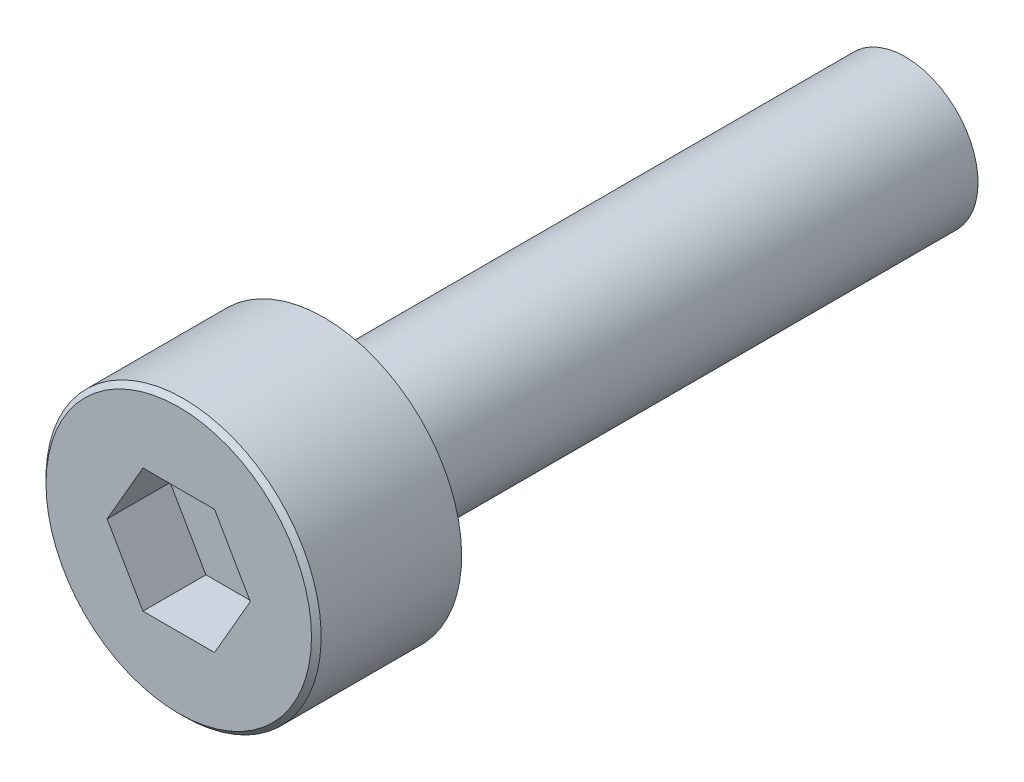
ISO-10303-21;
HEADER;
FILE_DESCRIPTION(('STEP AP214'),'2;1');
FILE_NAME('part.step','',(''),(''),'','','');
FILE_SCHEMA(('AUTOMOTIVE_DESIGN { 1 0 10303 214 1 1 1 1 }'));
ENDSEC;
DATA;
#1=APPLICATION_CONTEXT('core data for automotive mechanical design processes');
#2=APPLICATION_PROTOCOL_DEFINITION('international standard','automotive_design',2000,#1);
#3=PRODUCT_CONTEXT('',#1,'mechanical');
#4=PRODUCT('Part','Part','',(#3));
#5=PRODUCT_RELATED_PRODUCT_CATEGORY('part','',(#4));
#6=PRODUCT_DEFINITION_FORMATION('','',#4);
#7=PRODUCT_DEFINITION_CONTEXT('part definition',#1,'design');
#8=PRODUCT_DEFINITION('design','',#6,#7);
#9=PRODUCT_DEFINITION_SHAPE('','',#8);
#10=(LENGTH_UNIT() NAMED_UNIT(*) SI_UNIT(.MILLI.,.METRE.));
#11=(NAMED_UNIT(*) PLANE_ANGLE_UNIT() SI_UNIT($,.RADIAN.));
#12=(NAMED_UNIT(*) SI_UNIT($,.STERADIAN.) SOLID_ANGLE_UNIT());
#13=UNCERTAINTY_MEASURE_WITH_UNIT(LENGTH_MEASURE(1.E-05),#10,'distance_accuracy_value','');
#14=(GEOMETRIC_REPRESENTATION_CONTEXT(3) GLOBAL_UNCERTAINTY_ASSIGNED_CONTEXT((#13)) GLOBAL_UNIT_ASSIGNED_CONTEXT((#10,
#11,#12)) REPRESENTATION_CONTEXT('',''));
#15=CARTESIAN_POINT('',(0.,0.,0.));
#16=DIRECTION('',(0.,0.,1.));
#17=DIRECTION('',(1.,0.,0.));
#18=AXIS2_PLACEMENT_3D('',#15,#16,#17);
#19=CARTESIAN_POINT('',(0.,0.,0.));
#20=DIRECTION('',(0.,0.,1.));
#21=DIRECTION('',(0.,-1.,0.));
#22=AXIS2_PLACEMENT_3D('',#19,#20,#21);
#23=PLANE('',#22);
#24=CARTESIAN_POINT('',(0.,0.,0.));
#25=DIRECTION('',(0.,0.,1.));
#26=DIRECTION('',(0.,-1.,0.));
#27=AXIS2_PLACEMENT_3D('',#24,#25,#26);
#28=CIRCLE('',#27,2.73999999999999);
#29=CARTESIAN_POINT('',(0.,-2.73999999999999,0.));
#30=VERTEX_POINT('',#29);
#31=EDGE_CURVE('E11',#30,#30,#28,.T.);
#32=ORIENTED_EDGE('',*,*,#31,.T.);
#33=EDGE_LOOP('',(#32));
#34=FACE_BOUND('',#33,.T.);
#35=DIRECTION('',(-0.5,0.866025403784439,0.));
#36=VECTOR('',#35,1.);
#37=CARTESIAN_POINT('',(1.47801668912544,0.,0.));
#38=LINE('',#37,#36);
#39=CARTESIAN_POINT('',(1.47801668912544,0.,0.));
#40=VERTEX_POINT('',#39);
#41=CARTESIAN_POINT('',(0.739008344562721,1.28,0.));
#42=VERTEX_POINT('',#41);
#43=EDGE_CURVE('E57',#40,#42,#38,.T.);
#44=ORIENTED_EDGE('',*,*,#43,.F.);
#45=DIRECTION('',(0.5,0.866025403784439,0.));
#46=VECTOR('',#45,1.);
#47=CARTESIAN_POINT('',(0.739008344562721,-1.28,0.));
#48=LINE('',#47,#46);
#49=CARTESIAN_POINT('',(0.739008344562721,-1.28,0.));
#50=VERTEX_POINT('',#49);
#51=EDGE_CURVE('E140',#50,#40,#48,.T.);
#52=ORIENTED_EDGE('',*,*,#51,.F.);
#53=DIRECTION('',(1.,0.,0.));
#54=VECTOR('',#53,1.);
#55=CARTESIAN_POINT('',(-0.739008344562721,-1.28,0.));
#56=LINE('',#55,#54);
#57=CARTESIAN_POINT('',(-0.739008344562721,-1.28,0.));
#58=VERTEX_POINT('',#57);
#59=EDGE_CURVE('E138',#58,#50,#56,.T.);
#60=ORIENTED_EDGE('',*,*,#59,.F.);
#61=DIRECTION('',(0.5,-0.866025403784439,0.));
#62=VECTOR('',#61,1.);
#63=CARTESIAN_POINT('',(-1.47801668912544,0.,0.));
#64=LINE('',#63,#62);
#65=CARTESIAN_POINT('',(-1.47801668912544,0.,0.));
#66=VERTEX_POINT('',#65);
#67=EDGE_CURVE('E105',#66,#58,#64,.T.);
#68=ORIENTED_EDGE('',*,*,#67,.F.);
#69=DIRECTION('',(-0.5,-0.866025403784439,0.));
#70=VECTOR('',#69,1.);
#71=CARTESIAN_POINT('',(-0.739008344562721,1.28,0.));
#72=LINE('',#71,#70);
#73=CARTESIAN_POINT('',(-0.739008344562721,1.28,0.));
#74=VERTEX_POINT('',#73);
#75=EDGE_CURVE('E134',#74,#66,#72,.T.);
#76=ORIENTED_EDGE('',*,*,#75,.F.);
#77=DIRECTION('',(-1.,0.,0.));
#78=VECTOR('',#77,1.);
#79=CARTESIAN_POINT('',(0.739008344562721,1.28,0.));
#80=LINE('',#79,#78);
#81=EDGE_CURVE('E131',#42,#74,#80,.T.);
#82=ORIENTED_EDGE('',*,*,#81,.F.);
#83=EDGE_LOOP('',(#44,#52,#60,#68,#76,#82));
#84=FACE_BOUND('',#83,.T.);
#85=ADVANCED_FACE('F41',(#34,#84),#23,.T.);
#86=CARTESIAN_POINT('',(0.,0.,-15.));
#87=DIRECTION('',(0.,0.,-1.));
#88=DIRECTION('',(0.,1.,0.));
#89=AXIS2_PLACEMENT_3D('',#86,#87,#88);
#90=CYLINDRICAL_SURFACE('',#89,2.83999999999999);
#91=CARTESIAN_POINT('',(0.,0.,-0.100000000000001));
#92=DIRECTION('',(0.,0.,1.));
#93=DIRECTION('',(0.,-1.,0.));
#94=AXIS2_PLACEMENT_3D('',#91,#92,#93);
#95=CIRCLE('',#94,2.83999999999999);
#96=CARTESIAN_POINT('',(0.,-2.83999999999999,-0.100000000000001));
#97=VERTEX_POINT('',#96);
#98=EDGE_CURVE('E50',#97,#97,#95,.F.);
#99=ORIENTED_EDGE('',*,*,#98,.T.);
#100=EDGE_LOOP('',(#99));
#101=FACE_BOUND('',#100,.T.);
#102=CARTESIAN_POINT('',(0.,0.,-3.));
#103=DIRECTION('',(0.,0.,-1.));
#104=DIRECTION('',(0.,1.,0.));
#105=AXIS2_PLACEMENT_3D('',#102,#103,#104);
#106=CIRCLE('',#105,2.83999999999999);
#107=CARTESIAN_POINT('',(0.,2.83999999999999,-3.));
#108=VERTEX_POINT('',#107);
#109=EDGE_CURVE('E155',#108,#108,#106,.T.);
#110=ORIENTED_EDGE('',*,*,#109,.F.);
#111=EDGE_LOOP('',(#110));
#112=FACE_BOUND('',#111,.T.);
#113=ADVANCED_FACE('F160',(#101,#112),#90,.T.);
#114=CARTESIAN_POINT('',(0.,2.83999999999999,-3.));
#115=DIRECTION('',(0.,0.,-1.));
#116=DIRECTION('',(0.,1.,0.));
#117=AXIS2_PLACEMENT_3D('',#114,#115,#116);
#118=PLANE('',#117);
#119=ORIENTED_EDGE('',*,*,#109,.T.);
#120=EDGE_LOOP('',(#119));
#121=FACE_BOUND('',#120,.T.);
#122=CARTESIAN_POINT('',(0.,0.,-3.));
#123=DIRECTION('',(0.,0.,-1.));
#124=DIRECTION('',(0.,1.,0.));
#125=AXIS2_PLACEMENT_3D('',#122,#123,#124);
#126=CIRCLE('',#125,1.5);
#127=CARTESIAN_POINT('',(0.,1.5,-3.));
#128=VERTEX_POINT('',#127);
#129=EDGE_CURVE('E152',#128,#128,#126,.T.);
#130=ORIENTED_EDGE('',*,*,#129,.F.);
#131=EDGE_LOOP('',(#130));
#132=FACE_BOUND('',#131,.T.);
#133=ADVANCED_FACE('F176',(#121,#132),#118,.T.);
#134=CARTESIAN_POINT('',(0.,0.,-15.));
#135=DIRECTION('',(0.,0.,-1.));
#136=DIRECTION('',(0.,1.,0.));
#137=AXIS2_PLACEMENT_3D('',#134,#135,#136);
#138=CYLINDRICAL_SURFACE('',#137,1.5);
#139=ORIENTED_EDGE('',*,*,#129,.T.);
#140=EDGE_LOOP('',(#139));
#141=FACE_BOUND('',#140,.T.);
#142=CARTESIAN_POINT('',(0.,0.,-15.));
#143=DIRECTION('',(0.,0.,-1.));
#144=DIRECTION('',(0.,1.,0.));
#145=AXIS2_PLACEMENT_3D('',#142,#143,#144);
#146=CIRCLE('',#145,1.5);
#147=CARTESIAN_POINT('',(0.,1.5,-15.));
#148=VERTEX_POINT('',#147);
#149=EDGE_CURVE('E144',#148,#148,#146,.T.);
#150=ORIENTED_EDGE('',*,*,#149,.F.);
#151=EDGE_LOOP('',(#150));
#152=FACE_BOUND('',#151,.T.);
#153=ADVANCED_FACE('F182',(#141,#152),#138,.T.);
#154=CARTESIAN_POINT('',(0.,1.5,-15.));
#155=DIRECTION('',(0.,0.,-1.));
#156=DIRECTION('',(0.,1.,0.));
#157=AXIS2_PLACEMENT_3D('',#154,#155,#156);
#158=PLANE('',#157);
#159=ORIENTED_EDGE('',*,*,#149,.T.);
#160=EDGE_LOOP('',(#159));
#161=FACE_BOUND('',#160,.T.);
#162=ADVANCED_FACE('F186',(#161),#158,.T.);
#163=CARTESIAN_POINT('',(1.47801668912544,0.,-1.3));
#164=DIRECTION('',(0.866025403784439,0.5,0.));
#165=DIRECTION('',(-0.5,0.866025403784439,0.));
#166=AXIS2_PLACEMENT_3D('',#163,#164,#165);
#167=PLANE('',#166);
#168=ORIENTED_EDGE('',*,*,#43,.T.);
#169=DIRECTION('',(0.,0.,1.));
#170=VECTOR('',#169,1.);
#171=CARTESIAN_POINT('',(0.739008344562721,1.28,-1.3));
#172=LINE('',#171,#170);
#173=CARTESIAN_POINT('',(0.739008344562721,1.28,-1.3));
#174=VERTEX_POINT('',#173);
#175=EDGE_CURVE('E87',#174,#42,#172,.T.);
#176=ORIENTED_EDGE('',*,*,#175,.F.);
#177=DIRECTION('',(-0.5,0.866025403784439,0.));
#178=VECTOR('',#177,1.);
#179=CARTESIAN_POINT('',(1.47801668912544,0.,-1.3));
#180=LINE('',#179,#178);
#181=CARTESIAN_POINT('',(1.47801668912544,0.,-1.3));
#182=VERTEX_POINT('',#181);
#183=EDGE_CURVE('E142',#182,#174,#180,.T.);
#184=ORIENTED_EDGE('',*,*,#183,.F.);
#185=DIRECTION('',(0.,0.,1.));
#186=VECTOR('',#185,1.);
#187=CARTESIAN_POINT('',(1.47801668912544,0.,-1.3));
#188=LINE('',#187,#186);
#189=EDGE_CURVE('E65',#182,#40,#188,.T.);
#190=ORIENTED_EDGE('',*,*,#189,.T.);
#191=EDGE_LOOP('',(#168,#176,#184,#190));
#192=FACE_BOUND('',#191,.T.);
#193=ADVANCED_FACE('F190',(#192),#167,.F.);
#194=CARTESIAN_POINT('',(0.739008344562721,-1.28,-1.3));
#195=DIRECTION('',(0.866025403784439,-0.5,0.));
#196=DIRECTION('',(0.5,0.866025403784439,0.));
#197=AXIS2_PLACEMENT_3D('',#194,#195,#196);
#198=PLANE('',#197);
#199=ORIENTED_EDGE('',*,*,#51,.T.);
#200=ORIENTED_EDGE('',*,*,#189,.F.);
#201=DIRECTION('',(0.5,0.866025403784439,0.));
#202=VECTOR('',#201,1.);
#203=CARTESIAN_POINT('',(0.739008344562721,-1.28,-1.3));
#204=LINE('',#203,#202);
#205=CARTESIAN_POINT('',(0.739008344562721,-1.28,-1.3));
#206=VERTEX_POINT('',#205);
#207=EDGE_CURVE('E117',#206,#182,#204,.T.);
#208=ORIENTED_EDGE('',*,*,#207,.F.);
#209=DIRECTION('',(0.,0.,1.));
#210=VECTOR('',#209,1.);
#211=CARTESIAN_POINT('',(0.739008344562721,-1.28,-1.3));
#212=LINE('',#211,#210);
#213=EDGE_CURVE('E109',#206,#50,#212,.T.);
#214=ORIENTED_EDGE('',*,*,#213,.T.);
#215=EDGE_LOOP('',(#199,#200,#208,#214));
#216=FACE_BOUND('',#215,.T.);
#217=ADVANCED_FACE('F194',(#216),#198,.F.);
#218=CARTESIAN_POINT('',(-0.739008344562721,-1.28,-1.3));
#219=DIRECTION('',(0.,-1.,0.));
#220=DIRECTION('',(0.,0.,-1.));
#221=AXIS2_PLACEMENT_3D('',#218,#219,#220);
#222=PLANE('',#221);
#223=ORIENTED_EDGE('',*,*,#59,.T.);
#224=ORIENTED_EDGE('',*,*,#213,.F.);
#225=DIRECTION('',(1.,0.,0.));
#226=VECTOR('',#225,1.);
#227=CARTESIAN_POINT('',(-0.739008344562721,-1.28,-1.3));
#228=LINE('',#227,#226);
#229=CARTESIAN_POINT('',(-0.739008344562721,-1.28,-1.3));
#230=VERTEX_POINT('',#229);
#231=EDGE_CURVE('E113',#230,#206,#228,.T.);
#232=ORIENTED_EDGE('',*,*,#231,.F.);
#233=DIRECTION('',(0.,0.,1.));
#234=VECTOR('',#233,1.);
#235=CARTESIAN_POINT('',(-0.739008344562721,-1.28,-1.3));
#236=LINE('',#235,#234);
#237=EDGE_CURVE('E98',#230,#58,#236,.T.);
#238=ORIENTED_EDGE('',*,*,#237,.T.);
#239=EDGE_LOOP('',(#223,#224,#232,#238));
#240=FACE_BOUND('',#239,.T.);
#241=ADVANCED_FACE('F114',(#240),#222,.F.);
#242=CARTESIAN_POINT('',(-1.47801668912544,0.,-1.3));
#243=DIRECTION('',(-0.866025403784439,-0.5,0.));
#244=DIRECTION('',(0.5,-0.866025403784439,0.));
#245=AXIS2_PLACEMENT_3D('',#242,#243,#244);
#246=PLANE('',#245);
#247=ORIENTED_EDGE('',*,*,#67,.T.);
#248=ORIENTED_EDGE('',*,*,#237,.F.);
#249=DIRECTION('',(0.5,-0.866025403784439,0.));
#250=VECTOR('',#249,1.);
#251=CARTESIAN_POINT('',(-1.47801668912544,0.,-1.3));
#252=LINE('',#251,#250);
#253=CARTESIAN_POINT('',(-1.47801668912544,0.,-1.3));
#254=VERTEX_POINT('',#253);
#255=EDGE_CURVE('E102',#254,#230,#252,.T.);
#256=ORIENTED_EDGE('',*,*,#255,.F.);
#257=DIRECTION('',(0.,0.,1.));
#258=VECTOR('',#257,1.);
#259=CARTESIAN_POINT('',(-1.47801668912544,0.,-1.3));
#260=LINE('',#259,#258);
#261=EDGE_CURVE('E110',#254,#66,#260,.T.);
#262=ORIENTED_EDGE('',*,*,#261,.T.);
#263=EDGE_LOOP('',(#247,#248,#256,#262));
#264=FACE_BOUND('',#263,.T.);
#265=ADVANCED_FACE('F100',(#264),#246,.F.);
#266=CARTESIAN_POINT('',(-0.739008344562721,1.28,-1.3));
#267=DIRECTION('',(-0.866025403784439,0.5,0.));
#268=DIRECTION('',(-0.5,-0.866025403784439,0.));
#269=AXIS2_PLACEMENT_3D('',#266,#267,#268);
#270=PLANE('',#269);
#271=ORIENTED_EDGE('',*,*,#75,.T.);
#272=ORIENTED_EDGE('',*,*,#261,.F.);
#273=DIRECTION('',(-0.5,-0.866025403784439,0.));
#274=VECTOR('',#273,1.);
#275=CARTESIAN_POINT('',(-0.739008344562721,1.28,-1.3));
#276=LINE('',#275,#274);
#277=CARTESIAN_POINT('',(-0.739008344562721,1.28,-1.3));
#278=VERTEX_POINT('',#277);
#279=EDGE_CURVE('E123',#278,#254,#276,.T.);
#280=ORIENTED_EDGE('',*,*,#279,.F.);
#281=DIRECTION('',(0.,0.,1.));
#282=VECTOR('',#281,1.);
#283=CARTESIAN_POINT('',(-0.739008344562721,1.28,-1.3));
#284=LINE('',#283,#282);
#285=EDGE_CURVE('E147',#278,#74,#284,.T.);
#286=ORIENTED_EDGE('',*,*,#285,.T.);
#287=EDGE_LOOP('',(#271,#272,#280,#286));
#288=FACE_BOUND('',#287,.T.);
#289=ADVANCED_FACE('F197',(#288),#270,.F.);
#290=CARTESIAN_POINT('',(0.739008344562721,1.28,-1.3));
#291=DIRECTION('',(0.,1.,0.));
#292=DIRECTION('',(0.,0.,1.));
#293=AXIS2_PLACEMENT_3D('',#290,#291,#292);
#294=PLANE('',#293);
#295=ORIENTED_EDGE('',*,*,#81,.T.);
#296=ORIENTED_EDGE('',*,*,#285,.F.);
#297=DIRECTION('',(-1.,0.,0.));
#298=VECTOR('',#297,1.);
#299=CARTESIAN_POINT('',(0.739008344562721,1.28,-1.3));
#300=LINE('',#299,#298);
#301=EDGE_CURVE('E125',#174,#278,#300,.T.);
#302=ORIENTED_EDGE('',*,*,#301,.F.);
#303=ORIENTED_EDGE('',*,*,#175,.T.);
#304=EDGE_LOOP('',(#295,#296,#302,#303));
#305=FACE_BOUND('',#304,.T.);
#306=ADVANCED_FACE('F168',(#305),#294,.F.);
#307=CARTESIAN_POINT('',(0.,0.,-1.3));
#308=DIRECTION('',(0.,0.,1.));
#309=DIRECTION('',(1.,0.,0.));
#310=AXIS2_PLACEMENT_3D('',#307,#308,#309);
#311=PLANE('',#310);
#312=ORIENTED_EDGE('',*,*,#183,.T.);
#313=ORIENTED_EDGE('',*,*,#301,.T.);
#314=ORIENTED_EDGE('',*,*,#279,.T.);
#315=ORIENTED_EDGE('',*,*,#255,.T.);
#316=ORIENTED_EDGE('',*,*,#231,.T.);
#317=ORIENTED_EDGE('',*,*,#207,.T.);
#318=EDGE_LOOP('',(#312,#313,#314,#315,#316,#317));
#319=FACE_BOUND('',#318,.T.);
#320=ADVANCED_FACE('F120',(#319),#311,.T.);
#321=CARTESIAN_POINT('',(0.,0.,-0.100000000000001));
#322=DIRECTION('',(0.,0.,-1.));
#323=DIRECTION('',(0.,1.,0.));
#324=AXIS2_PLACEMENT_3D('',#321,#322,#323);
#325=CONICAL_SURFACE('',#324,2.83999999999999,0.785398163397446);
#326=ORIENTED_EDGE('',*,*,#31,.F.);
#327=EDGE_LOOP('',(#326));
#328=FACE_BOUND('',#327,.T.);
#329=ORIENTED_EDGE('',*,*,#98,.F.);
#330=EDGE_LOOP('',(#329));
#331=FACE_BOUND('',#330,.T.);
#332=ADVANCED_FACE('F44',(#328,#331),#325,.T.);
#333=CLOSED_SHELL('',(#85,#113,#133,#153,#162,#193,#217,#241,#265,#289,#306,#320,#332));
#334=MANIFOLD_SOLID_BREP('B2',#333);
#335=ADVANCED_BREP_SHAPE_REPRESENTATION('',(#18,#334),#14);
#336=SHAPE_DEFINITION_REPRESENTATION(#9,#335);
ENDSEC;
END-ISO-10303-21;
